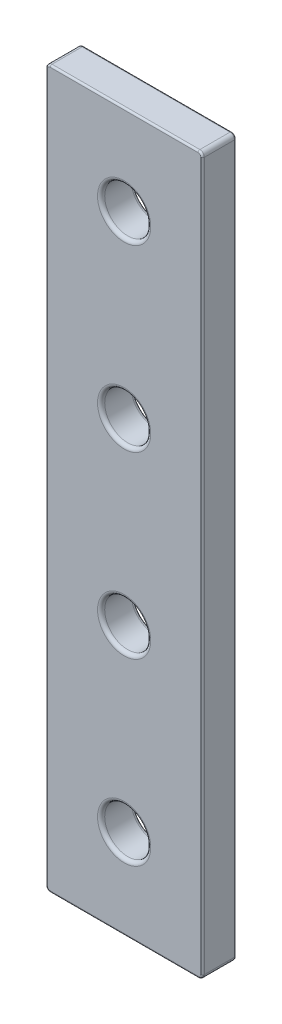
ISO-10303-21;
HEADER;
FILE_DESCRIPTION(('STEP AP214'),'2;1');
FILE_NAME('part.step','',(''),(''),'','','');
FILE_SCHEMA(('AUTOMOTIVE_DESIGN { 1 0 10303 214 1 1 1 1 }'));
ENDSEC;
DATA;
#1=APPLICATION_CONTEXT('core data for automotive mechanical design processes');
#2=APPLICATION_PROTOCOL_DEFINITION('international standard','automotive_design',2000,#1);
#3=PRODUCT_CONTEXT('',#1,'mechanical');
#4=PRODUCT('Part','Part','',(#3));
#5=PRODUCT_RELATED_PRODUCT_CATEGORY('part','',(#4));
#6=PRODUCT_DEFINITION_FORMATION('','',#4);
#7=PRODUCT_DEFINITION_CONTEXT('part definition',#1,'design');
#8=PRODUCT_DEFINITION('design','',#6,#7);
#9=PRODUCT_DEFINITION_SHAPE('','',#8);
#10=(LENGTH_UNIT() NAMED_UNIT(*) SI_UNIT(.MILLI.,.METRE.));
#11=(NAMED_UNIT(*) PLANE_ANGLE_UNIT() SI_UNIT($,.RADIAN.));
#12=(NAMED_UNIT(*) SI_UNIT($,.STERADIAN.) SOLID_ANGLE_UNIT());
#13=UNCERTAINTY_MEASURE_WITH_UNIT(LENGTH_MEASURE(1.E-05),#10,'distance_accuracy_value','');
#14=(GEOMETRIC_REPRESENTATION_CONTEXT(3) GLOBAL_UNCERTAINTY_ASSIGNED_CONTEXT((#13)) GLOBAL_UNIT_ASSIGNED_CONTEXT((#10,
#11,#12)) REPRESENTATION_CONTEXT('',''));
#15=CARTESIAN_POINT('',(0.,0.,0.));
#16=DIRECTION('',(0.,0.,1.));
#17=DIRECTION('',(1.,0.,0.));
#18=AXIS2_PLACEMENT_3D('',#15,#16,#17);
#19=CARTESIAN_POINT('',(0.,-38.1,-2.3876));
#20=DIRECTION('',(0.,0.,1.));
#21=DIRECTION('',(1.,0.,0.));
#22=AXIS2_PLACEMENT_3D('',#19,#20,#21);
#23=CYLINDRICAL_SURFACE('',#22,3.2639);
#24=CARTESIAN_POINT('',(0.,-38.1,-1.8796));
#25=DIRECTION('',(0.,0.,-1.));
#26=DIRECTION('',(-1.,0.,0.));
#27=AXIS2_PLACEMENT_3D('',#24,#25,#26);
#28=CIRCLE('',#27,3.2639);
#29=CARTESIAN_POINT('',(-3.2639,-38.1,-1.8796));
#30=VERTEX_POINT('',#29);
#31=EDGE_CURVE('E395',#30,#30,#28,.T.);
#32=ORIENTED_EDGE('',*,*,#31,.T.);
#33=EDGE_LOOP('',(#32));
#34=FACE_BOUND('',#33,.T.);
#35=CARTESIAN_POINT('',(0.,-38.1,1.8796));
#36=DIRECTION('',(0.,0.,-1.));
#37=DIRECTION('',(-1.,0.,0.));
#38=AXIS2_PLACEMENT_3D('',#35,#36,#37);
#39=CIRCLE('',#38,3.2639);
#40=CARTESIAN_POINT('',(-3.2639,-38.1,1.8796));
#41=VERTEX_POINT('',#40);
#42=EDGE_CURVE('E391',#41,#41,#39,.F.);
#43=ORIENTED_EDGE('',*,*,#42,.T.);
#44=EDGE_LOOP('',(#43));
#45=FACE_BOUND('',#44,.T.);
#46=ADVANCED_FACE('F51',(#34,#45),#23,.F.);
#47=CARTESIAN_POINT('',(0.,-12.7,-2.3876));
#48=DIRECTION('',(0.,0.,1.));
#49=DIRECTION('',(1.,0.,0.));
#50=AXIS2_PLACEMENT_3D('',#47,#48,#49);
#51=CYLINDRICAL_SURFACE('',#50,3.2639);
#52=CARTESIAN_POINT('',(0.,-12.7,-1.8796));
#53=DIRECTION('',(0.,0.,-1.));
#54=DIRECTION('',(-1.,0.,0.));
#55=AXIS2_PLACEMENT_3D('',#52,#53,#54);
#56=CIRCLE('',#55,3.2639);
#57=CARTESIAN_POINT('',(-3.2639,-12.7,-1.8796));
#58=VERTEX_POINT('',#57);
#59=EDGE_CURVE('E403',#58,#58,#56,.T.);
#60=ORIENTED_EDGE('',*,*,#59,.T.);
#61=EDGE_LOOP('',(#60));
#62=FACE_BOUND('',#61,.T.);
#63=CARTESIAN_POINT('',(0.,-12.7,1.8796));
#64=DIRECTION('',(0.,0.,-1.));
#65=DIRECTION('',(-1.,0.,0.));
#66=AXIS2_PLACEMENT_3D('',#63,#64,#65);
#67=CIRCLE('',#66,3.2639);
#68=CARTESIAN_POINT('',(-3.2639,-12.7,1.8796));
#69=VERTEX_POINT('',#68);
#70=EDGE_CURVE('E399',#69,#69,#67,.F.);
#71=ORIENTED_EDGE('',*,*,#70,.T.);
#72=EDGE_LOOP('',(#71));
#73=FACE_BOUND('',#72,.T.);
#74=ADVANCED_FACE('F446',(#62,#73),#51,.F.);
#75=CARTESIAN_POINT('',(-11.1125,50.8,2.3876));
#76=DIRECTION('',(0.,-1.,0.));
#77=DIRECTION('',(0.,0.,-1.));
#78=AXIS2_PLACEMENT_3D('',#75,#76,#77);
#79=PLANE('',#78);
#80=DIRECTION('',(0.,0.,-1.));
#81=VECTOR('',#80,1.);
#82=CARTESIAN_POINT('',(10.4775,50.8,2.3876));
#83=LINE('',#82,#81);
#84=CARTESIAN_POINT('',(10.4775,50.8,2.1336));
#85=VERTEX_POINT('',#84);
#86=CARTESIAN_POINT('',(10.4775,50.8,-2.1336));
#87=VERTEX_POINT('',#86);
#88=EDGE_CURVE('E232',#85,#87,#83,.T.);
#89=ORIENTED_EDGE('',*,*,#88,.T.);
#90=DIRECTION('',(-1.,0.,0.));
#91=VECTOR('',#90,1.);
#92=CARTESIAN_POINT('',(-10.4775,50.8,-2.1336));
#93=LINE('',#92,#91);
#94=CARTESIAN_POINT('',(-10.4775,50.8,-2.1336));
#95=VERTEX_POINT('',#94);
#96=EDGE_CURVE('E288',#87,#95,#93,.T.);
#97=ORIENTED_EDGE('',*,*,#96,.T.);
#98=DIRECTION('',(0.,0.,-1.));
#99=VECTOR('',#98,1.);
#100=CARTESIAN_POINT('',(-10.4775,50.8,2.3876));
#101=LINE('',#100,#99);
#102=CARTESIAN_POINT('',(-10.4775,50.8,2.1336));
#103=VERTEX_POINT('',#102);
#104=EDGE_CURVE('E225',#95,#103,#101,.F.);
#105=ORIENTED_EDGE('',*,*,#104,.T.);
#106=DIRECTION('',(-1.,0.,0.));
#107=VECTOR('',#106,1.);
#108=CARTESIAN_POINT('',(-11.1125,50.8,2.1336));
#109=LINE('',#108,#107);
#110=EDGE_CURVE('E285',#103,#85,#109,.F.);
#111=ORIENTED_EDGE('',*,*,#110,.T.);
#112=EDGE_LOOP('',(#89,#97,#105,#111));
#113=FACE_BOUND('',#112,.T.);
#114=ADVANCED_FACE('F448',(#113),#79,.F.);
#115=CARTESIAN_POINT('',(-11.1125,50.8,2.3876));
#116=DIRECTION('',(1.,0.,0.));
#117=DIRECTION('',(0.,0.,-1.));
#118=AXIS2_PLACEMENT_3D('',#115,#116,#117);
#119=PLANE('',#118);
#120=DIRECTION('',(0.,0.,-1.));
#121=VECTOR('',#120,1.);
#122=CARTESIAN_POINT('',(-11.1125,50.165,2.3876));
#123=LINE('',#122,#121);
#124=CARTESIAN_POINT('',(-11.1125,50.165,2.1336));
#125=VERTEX_POINT('',#124);
#126=CARTESIAN_POINT('',(-11.1125,50.165,-2.1336));
#127=VERTEX_POINT('',#126);
#128=EDGE_CURVE('E614',#125,#127,#123,.T.);
#129=ORIENTED_EDGE('',*,*,#128,.T.);
#130=DIRECTION('',(0.,-1.,0.));
#131=VECTOR('',#130,1.);
#132=CARTESIAN_POINT('',(-11.1125,-50.165,-2.1336));
#133=LINE('',#132,#131);
#134=CARTESIAN_POINT('',(-11.1125,-50.165,-2.1336));
#135=VERTEX_POINT('',#134);
#136=EDGE_CURVE('E276',#127,#135,#133,.T.);
#137=ORIENTED_EDGE('',*,*,#136,.T.);
#138=DIRECTION('',(0.,0.,-1.));
#139=VECTOR('',#138,1.);
#140=CARTESIAN_POINT('',(-11.1125,-50.165,2.3876));
#141=LINE('',#140,#139);
#142=CARTESIAN_POINT('',(-11.1125,-50.165,2.1336));
#143=VERTEX_POINT('',#142);
#144=EDGE_CURVE('E610',#135,#143,#141,.F.);
#145=ORIENTED_EDGE('',*,*,#144,.T.);
#146=DIRECTION('',(0.,-1.,0.));
#147=VECTOR('',#146,1.);
#148=CARTESIAN_POINT('',(-11.1125,50.8,2.1336));
#149=LINE('',#148,#147);
#150=EDGE_CURVE('E273',#143,#125,#149,.F.);
#151=ORIENTED_EDGE('',*,*,#150,.T.);
#152=EDGE_LOOP('',(#129,#137,#145,#151));
#153=FACE_BOUND('',#152,.T.);
#154=ADVANCED_FACE('F454',(#153),#119,.F.);
#155=CARTESIAN_POINT('',(-11.1125,-50.8,2.3876));
#156=DIRECTION('',(0.,1.,0.));
#157=DIRECTION('',(0.,0.,1.));
#158=AXIS2_PLACEMENT_3D('',#155,#156,#157);
#159=PLANE('',#158);
#160=DIRECTION('',(0.,0.,-1.));
#161=VECTOR('',#160,1.);
#162=CARTESIAN_POINT('',(-10.4775,-50.8,2.3876));
#163=LINE('',#162,#161);
#164=CARTESIAN_POINT('',(-10.4775,-50.8,2.1336));
#165=VERTEX_POINT('',#164);
#166=CARTESIAN_POINT('',(-10.4775,-50.8,-2.1336));
#167=VERTEX_POINT('',#166);
#168=EDGE_CURVE('E623',#165,#167,#163,.T.);
#169=ORIENTED_EDGE('',*,*,#168,.T.);
#170=DIRECTION('',(1.,0.,0.));
#171=VECTOR('',#170,1.);
#172=CARTESIAN_POINT('',(10.4775,-50.8,-2.1336));
#173=LINE('',#172,#171);
#174=CARTESIAN_POINT('',(10.4775,-50.8,-2.1336));
#175=VERTEX_POINT('',#174);
#176=EDGE_CURVE('E264',#167,#175,#173,.T.);
#177=ORIENTED_EDGE('',*,*,#176,.T.);
#178=DIRECTION('',(0.,0.,-1.));
#179=VECTOR('',#178,1.);
#180=CARTESIAN_POINT('',(10.4775,-50.8,2.3876));
#181=LINE('',#180,#179);
#182=CARTESIAN_POINT('',(10.4775,-50.8,2.1336));
#183=VERTEX_POINT('',#182);
#184=EDGE_CURVE('E619',#175,#183,#181,.F.);
#185=ORIENTED_EDGE('',*,*,#184,.T.);
#186=DIRECTION('',(1.,0.,0.));
#187=VECTOR('',#186,1.);
#188=CARTESIAN_POINT('',(-11.1125,-50.8,2.1336));
#189=LINE('',#188,#187);
#190=EDGE_CURVE('E261',#183,#165,#189,.F.);
#191=ORIENTED_EDGE('',*,*,#190,.T.);
#192=EDGE_LOOP('',(#169,#177,#185,#191));
#193=FACE_BOUND('',#192,.T.);
#194=ADVANCED_FACE('F576',(#193),#159,.F.);
#195=CARTESIAN_POINT('',(11.1125,50.8,2.3876));
#196=DIRECTION('',(-1.,0.,0.));
#197=DIRECTION('',(0.,0.,1.));
#198=AXIS2_PLACEMENT_3D('',#195,#196,#197);
#199=PLANE('',#198);
#200=DIRECTION('',(0.,0.,-1.));
#201=VECTOR('',#200,1.);
#202=CARTESIAN_POINT('',(11.1125,-50.165,2.3876));
#203=LINE('',#202,#201);
#204=CARTESIAN_POINT('',(11.1125,-50.165,2.1336));
#205=VERTEX_POINT('',#204);
#206=CARTESIAN_POINT('',(11.1125,-50.165,-2.1336));
#207=VERTEX_POINT('',#206);
#208=EDGE_CURVE('E627',#205,#207,#203,.T.);
#209=ORIENTED_EDGE('',*,*,#208,.T.);
#210=DIRECTION('',(0.,1.,0.));
#211=VECTOR('',#210,1.);
#212=CARTESIAN_POINT('',(11.1125,50.165,-2.1336));
#213=LINE('',#212,#211);
#214=CARTESIAN_POINT('',(11.1125,50.165,-2.1336));
#215=VERTEX_POINT('',#214);
#216=EDGE_CURVE('E321',#207,#215,#213,.T.);
#217=ORIENTED_EDGE('',*,*,#216,.T.);
#218=DIRECTION('',(0.,0.,-1.));
#219=VECTOR('',#218,1.);
#220=CARTESIAN_POINT('',(11.1125,50.165,2.3876));
#221=LINE('',#220,#219);
#222=CARTESIAN_POINT('',(11.1125,50.165,2.1336));
#223=VERTEX_POINT('',#222);
#224=EDGE_CURVE('E347',#215,#223,#221,.F.);
#225=ORIENTED_EDGE('',*,*,#224,.T.);
#226=DIRECTION('',(0.,1.,0.));
#227=VECTOR('',#226,1.);
#228=CARTESIAN_POINT('',(11.1125,50.8,2.1336));
#229=LINE('',#228,#227);
#230=EDGE_CURVE('E318',#223,#205,#229,.F.);
#231=ORIENTED_EDGE('',*,*,#230,.T.);
#232=EDGE_LOOP('',(#209,#217,#225,#231));
#233=FACE_BOUND('',#232,.T.);
#234=ADVANCED_FACE('F568',(#233),#199,.F.);
#235=CARTESIAN_POINT('',(0.,0.,2.3876));
#236=DIRECTION('',(0.,0.,-1.));
#237=DIRECTION('',(-1.,0.,0.));
#238=AXIS2_PLACEMENT_3D('',#235,#236,#237);
#239=PLANE('',#238);
#240=CARTESIAN_POINT('',(0.,-38.1,2.3876));
#241=DIRECTION('',(0.,0.,-1.));
#242=DIRECTION('',(-1.,0.,0.));
#243=AXIS2_PLACEMENT_3D('',#240,#241,#242);
#244=CIRCLE('',#243,3.7719);
#245=CARTESIAN_POINT('',(-3.7719,-38.1,2.3876));
#246=VERTEX_POINT('',#245);
#247=EDGE_CURVE('E11',#246,#246,#244,.T.);
#248=ORIENTED_EDGE('',*,*,#247,.T.);
#249=EDGE_LOOP('',(#248));
#250=FACE_BOUND('',#249,.T.);
#251=CARTESIAN_POINT('',(0.,-12.7,2.3876));
#252=DIRECTION('',(0.,0.,-1.));
#253=DIRECTION('',(-1.,0.,0.));
#254=AXIS2_PLACEMENT_3D('',#251,#252,#253);
#255=CIRCLE('',#254,3.7719);
#256=CARTESIAN_POINT('',(-3.7719,-12.7,2.3876));
#257=VERTEX_POINT('',#256);
#258=EDGE_CURVE('E60',#257,#257,#255,.T.);
#259=ORIENTED_EDGE('',*,*,#258,.T.);
#260=EDGE_LOOP('',(#259));
#261=FACE_BOUND('',#260,.T.);
#262=CARTESIAN_POINT('',(0.,38.1,2.3876));
#263=DIRECTION('',(0.,0.,-1.));
#264=DIRECTION('',(-1.,0.,0.));
#265=AXIS2_PLACEMENT_3D('',#262,#263,#264);
#266=CIRCLE('',#265,3.7719);
#267=CARTESIAN_POINT('',(-3.7719,38.1,2.3876));
#268=VERTEX_POINT('',#267);
#269=EDGE_CURVE('E427',#268,#268,#266,.T.);
#270=ORIENTED_EDGE('',*,*,#269,.T.);
#271=EDGE_LOOP('',(#270));
#272=FACE_BOUND('',#271,.T.);
#273=CARTESIAN_POINT('',(0.,12.7,2.3876));
#274=DIRECTION('',(0.,0.,-1.));
#275=DIRECTION('',(-1.,0.,0.));
#276=AXIS2_PLACEMENT_3D('',#273,#274,#275);
#277=CIRCLE('',#276,3.7719);
#278=CARTESIAN_POINT('',(-3.7719,12.7,2.3876));
#279=VERTEX_POINT('',#278);
#280=EDGE_CURVE('E423',#279,#279,#277,.T.);
#281=ORIENTED_EDGE('',*,*,#280,.T.);
#282=EDGE_LOOP('',(#281));
#283=FACE_BOUND('',#282,.T.);
#284=DIRECTION('',(1.,0.,0.));
#285=VECTOR('',#284,1.);
#286=CARTESIAN_POINT('',(0.,-50.546,2.3876));
#287=LINE('',#286,#285);
#288=CARTESIAN_POINT('',(-10.4775,-50.546,2.3876));
#289=VERTEX_POINT('',#288);
#290=CARTESIAN_POINT('',(10.4775,-50.546,2.3876));
#291=VERTEX_POINT('',#290);
#292=EDGE_CURVE('E70',#289,#291,#287,.T.);
#293=ORIENTED_EDGE('',*,*,#292,.T.);
#294=CARTESIAN_POINT('',(10.4775,-50.165,2.3876));
#295=DIRECTION('',(0.,0.,-1.));
#296=DIRECTION('',(-1.,0.,0.));
#297=AXIS2_PLACEMENT_3D('',#294,#295,#296);
#298=CIRCLE('',#297,0.381);
#299=CARTESIAN_POINT('',(10.8585,-50.165,2.3876));
#300=VERTEX_POINT('',#299);
#301=EDGE_CURVE('E315',#291,#300,#298,.F.);
#302=ORIENTED_EDGE('',*,*,#301,.T.);
#303=DIRECTION('',(0.,1.,0.));
#304=VECTOR('',#303,1.);
#305=CARTESIAN_POINT('',(10.8585,0.,2.3876));
#306=LINE('',#305,#304);
#307=CARTESIAN_POINT('',(10.8585,50.165,2.3876));
#308=VERTEX_POINT('',#307);
#309=EDGE_CURVE('E296',#300,#308,#306,.T.);
#310=ORIENTED_EDGE('',*,*,#309,.T.);
#311=CARTESIAN_POINT('',(10.4775,50.165,2.3876));
#312=DIRECTION('',(0.,0.,-1.));
#313=DIRECTION('',(-1.,0.,0.));
#314=AXIS2_PLACEMENT_3D('',#311,#312,#313);
#315=CIRCLE('',#314,0.381);
#316=CARTESIAN_POINT('',(10.4775,50.546,2.3876));
#317=VERTEX_POINT('',#316);
#318=EDGE_CURVE('E299',#308,#317,#315,.F.);
#319=ORIENTED_EDGE('',*,*,#318,.T.);
#320=DIRECTION('',(-1.,0.,0.));
#321=VECTOR('',#320,1.);
#322=CARTESIAN_POINT('',(0.,50.546,2.3876));
#323=LINE('',#322,#321);
#324=CARTESIAN_POINT('',(-10.4775,50.546,2.3876));
#325=VERTEX_POINT('',#324);
#326=EDGE_CURVE('E302',#317,#325,#323,.T.);
#327=ORIENTED_EDGE('',*,*,#326,.T.);
#328=CARTESIAN_POINT('',(-10.4775,50.165,2.3876));
#329=DIRECTION('',(0.,0.,-1.));
#330=DIRECTION('',(-1.,0.,0.));
#331=AXIS2_PLACEMENT_3D('',#328,#329,#330);
#332=CIRCLE('',#331,0.381);
#333=CARTESIAN_POINT('',(-10.8585,50.165,2.3876));
#334=VERTEX_POINT('',#333);
#335=EDGE_CURVE('E305',#325,#334,#332,.F.);
#336=ORIENTED_EDGE('',*,*,#335,.T.);
#337=DIRECTION('',(0.,-1.,0.));
#338=VECTOR('',#337,1.);
#339=CARTESIAN_POINT('',(-10.8585,0.,2.3876));
#340=LINE('',#339,#338);
#341=CARTESIAN_POINT('',(-10.8585,-50.165,2.3876));
#342=VERTEX_POINT('',#341);
#343=EDGE_CURVE('E308',#334,#342,#340,.T.);
#344=ORIENTED_EDGE('',*,*,#343,.T.);
#345=CARTESIAN_POINT('',(-10.4775,-50.165,2.3876));
#346=DIRECTION('',(0.,0.,-1.));
#347=DIRECTION('',(-1.,0.,0.));
#348=AXIS2_PLACEMENT_3D('',#345,#346,#347);
#349=CIRCLE('',#348,0.381);
#350=EDGE_CURVE('E78',#342,#289,#349,.F.);
#351=ORIENTED_EDGE('',*,*,#350,.T.);
#352=EDGE_LOOP('',(#293,#302,#310,#319,#327,#336,#344,#351));
#353=FACE_BOUND('',#352,.T.);
#354=ADVANCED_FACE('F435',(#250,#261,#272,#283,#353),#239,.F.);
#355=CARTESIAN_POINT('',(0.,0.,-2.3876));
#356=DIRECTION('',(0.,0.,-1.));
#357=DIRECTION('',(-1.,0.,0.));
#358=AXIS2_PLACEMENT_3D('',#355,#356,#357);
#359=PLANE('',#358);
#360=CARTESIAN_POINT('',(0.,-38.1,-2.3876));
#361=DIRECTION('',(0.,0.,-1.));
#362=DIRECTION('',(-1.,0.,0.));
#363=AXIS2_PLACEMENT_3D('',#360,#361,#362);
#364=CIRCLE('',#363,3.7719);
#365=CARTESIAN_POINT('',(-3.7719,-38.1,-2.3876));
#366=VERTEX_POINT('',#365);
#367=EDGE_CURVE('E388',#366,#366,#364,.F.);
#368=ORIENTED_EDGE('',*,*,#367,.T.);
#369=EDGE_LOOP('',(#368));
#370=FACE_BOUND('',#369,.T.);
#371=CARTESIAN_POINT('',(0.,-12.7,-2.3876));
#372=DIRECTION('',(0.,0.,-1.));
#373=DIRECTION('',(-1.,0.,0.));
#374=AXIS2_PLACEMENT_3D('',#371,#372,#373);
#375=CIRCLE('',#374,3.7719);
#376=CARTESIAN_POINT('',(-3.7719,-12.7,-2.3876));
#377=VERTEX_POINT('',#376);
#378=EDGE_CURVE('E384',#377,#377,#375,.F.);
#379=ORIENTED_EDGE('',*,*,#378,.T.);
#380=EDGE_LOOP('',(#379));
#381=FACE_BOUND('',#380,.T.);
#382=CARTESIAN_POINT('',(0.,38.1,-2.3876));
#383=DIRECTION('',(0.,0.,-1.));
#384=DIRECTION('',(-1.,0.,0.));
#385=AXIS2_PLACEMENT_3D('',#382,#383,#384);
#386=CIRCLE('',#385,3.7719);
#387=CARTESIAN_POINT('',(-3.7719,38.1,-2.3876));
#388=VERTEX_POINT('',#387);
#389=EDGE_CURVE('E380',#388,#388,#386,.F.);
#390=ORIENTED_EDGE('',*,*,#389,.T.);
#391=EDGE_LOOP('',(#390));
#392=FACE_BOUND('',#391,.T.);
#393=CARTESIAN_POINT('',(0.,12.7,-2.3876));
#394=DIRECTION('',(0.,0.,-1.));
#395=DIRECTION('',(-1.,0.,0.));
#396=AXIS2_PLACEMENT_3D('',#393,#394,#395);
#397=CIRCLE('',#396,3.7719);
#398=CARTESIAN_POINT('',(-3.7719,12.7,-2.3876));
#399=VERTEX_POINT('',#398);
#400=EDGE_CURVE('E323',#399,#399,#397,.F.);
#401=ORIENTED_EDGE('',*,*,#400,.T.);
#402=EDGE_LOOP('',(#401));
#403=FACE_BOUND('',#402,.T.);
#404=DIRECTION('',(0.,1.,0.));
#405=VECTOR('',#404,1.);
#406=CARTESIAN_POINT('',(10.8585,-50.165,-2.3876));
#407=LINE('',#406,#405);
#408=CARTESIAN_POINT('',(10.8585,50.165,-2.3876));
#409=VERTEX_POINT('',#408);
#410=CARTESIAN_POINT('',(10.8585,-50.165,-2.3876));
#411=VERTEX_POINT('',#410);
#412=EDGE_CURVE('E201',#409,#411,#407,.F.);
#413=ORIENTED_EDGE('',*,*,#412,.T.);
#414=CARTESIAN_POINT('',(10.4775,-50.165,-2.3876));
#415=DIRECTION('',(0.,0.,-1.));
#416=DIRECTION('',(-1.,0.,0.));
#417=AXIS2_PLACEMENT_3D('',#414,#415,#416);
#418=CIRCLE('',#417,0.381);
#419=CARTESIAN_POINT('',(10.4775,-50.546,-2.3876));
#420=VERTEX_POINT('',#419);
#421=EDGE_CURVE('E250',#411,#420,#418,.T.);
#422=ORIENTED_EDGE('',*,*,#421,.T.);
#423=DIRECTION('',(1.,0.,0.));
#424=VECTOR('',#423,1.);
#425=CARTESIAN_POINT('',(-10.4775,-50.546,-2.3876));
#426=LINE('',#425,#424);
#427=CARTESIAN_POINT('',(-10.4775,-50.546,-2.3876));
#428=VERTEX_POINT('',#427);
#429=EDGE_CURVE('E247',#420,#428,#426,.F.);
#430=ORIENTED_EDGE('',*,*,#429,.T.);
#431=CARTESIAN_POINT('',(-10.4775,-50.165,-2.3876));
#432=DIRECTION('',(0.,0.,-1.));
#433=DIRECTION('',(-1.,0.,0.));
#434=AXIS2_PLACEMENT_3D('',#431,#432,#433);
#435=CIRCLE('',#434,0.381);
#436=CARTESIAN_POINT('',(-10.8585,-50.165,-2.3876));
#437=VERTEX_POINT('',#436);
#438=EDGE_CURVE('E244',#428,#437,#435,.T.);
#439=ORIENTED_EDGE('',*,*,#438,.T.);
#440=DIRECTION('',(0.,-1.,0.));
#441=VECTOR('',#440,1.);
#442=CARTESIAN_POINT('',(-10.8585,50.165,-2.3876));
#443=LINE('',#442,#441);
#444=CARTESIAN_POINT('',(-10.8585,50.165,-2.3876));
#445=VERTEX_POINT('',#444);
#446=EDGE_CURVE('E241',#437,#445,#443,.F.);
#447=ORIENTED_EDGE('',*,*,#446,.T.);
#448=CARTESIAN_POINT('',(-10.4775,50.165,-2.3876));
#449=DIRECTION('',(0.,0.,-1.));
#450=DIRECTION('',(-1.,0.,0.));
#451=AXIS2_PLACEMENT_3D('',#448,#449,#450);
#452=CIRCLE('',#451,0.381);
#453=CARTESIAN_POINT('',(-10.4775,50.546,-2.3876));
#454=VERTEX_POINT('',#453);
#455=EDGE_CURVE('E238',#445,#454,#452,.T.);
#456=ORIENTED_EDGE('',*,*,#455,.T.);
#457=DIRECTION('',(-1.,0.,0.));
#458=VECTOR('',#457,1.);
#459=CARTESIAN_POINT('',(10.4775,50.546,-2.3876));
#460=LINE('',#459,#458);
#461=CARTESIAN_POINT('',(10.4775,50.546,-2.3876));
#462=VERTEX_POINT('',#461);
#463=EDGE_CURVE('E204',#454,#462,#460,.F.);
#464=ORIENTED_EDGE('',*,*,#463,.T.);
#465=CARTESIAN_POINT('',(10.4775,50.165,-2.3876));
#466=DIRECTION('',(0.,0.,-1.));
#467=DIRECTION('',(-1.,0.,0.));
#468=AXIS2_PLACEMENT_3D('',#465,#466,#467);
#469=CIRCLE('',#468,0.381);
#470=EDGE_CURVE('E196',#462,#409,#469,.T.);
#471=ORIENTED_EDGE('',*,*,#470,.T.);
#472=EDGE_LOOP('',(#413,#422,#430,#439,#447,#456,#464,#471));
#473=FACE_BOUND('',#472,.T.);
#474=ADVANCED_FACE('F198',(#370,#381,#392,#403,#473),#359,.T.);
#475=CARTESIAN_POINT('',(10.4775,-50.165,2.3876));
#476=DIRECTION('',(0.,0.,-1.));
#477=DIRECTION('',(-1.,0.,0.));
#478=AXIS2_PLACEMENT_3D('',#475,#476,#477);
#479=CYLINDRICAL_SURFACE('',#478,0.635);
#480=ORIENTED_EDGE('',*,*,#184,.F.);
#481=CARTESIAN_POINT('',(10.4775,-50.165,-2.1336));
#482=DIRECTION('',(0.,0.,-1.));
#483=DIRECTION('',(-1.,0.,0.));
#484=AXIS2_PLACEMENT_3D('',#481,#482,#483);
#485=CIRCLE('',#484,0.635);
#486=EDGE_CURVE('E257',#175,#207,#485,.F.);
#487=ORIENTED_EDGE('',*,*,#486,.T.);
#488=ORIENTED_EDGE('',*,*,#208,.F.);
#489=CARTESIAN_POINT('',(10.4775,-50.165,2.1336));
#490=DIRECTION('',(0.,0.,-1.));
#491=DIRECTION('',(-1.,0.,0.));
#492=AXIS2_PLACEMENT_3D('',#489,#490,#491);
#493=CIRCLE('',#492,0.635);
#494=EDGE_CURVE('E253',#205,#183,#493,.T.);
#495=ORIENTED_EDGE('',*,*,#494,.T.);
#496=EDGE_LOOP('',(#480,#487,#488,#495));
#497=FACE_BOUND('',#496,.T.);
#498=ADVANCED_FACE('F572',(#497),#479,.T.);
#499=CARTESIAN_POINT('',(-10.4775,-50.165,2.3876));
#500=DIRECTION('',(0.,0.,-1.));
#501=DIRECTION('',(-1.,0.,0.));
#502=AXIS2_PLACEMENT_3D('',#499,#500,#501);
#503=CYLINDRICAL_SURFACE('',#502,0.635);
#504=ORIENTED_EDGE('',*,*,#144,.F.);
#505=CARTESIAN_POINT('',(-10.4775,-50.165,-2.1336));
#506=DIRECTION('',(0.,0.,-1.));
#507=DIRECTION('',(-1.,0.,0.));
#508=AXIS2_PLACEMENT_3D('',#505,#506,#507);
#509=CIRCLE('',#508,0.635);
#510=EDGE_CURVE('E270',#135,#167,#509,.F.);
#511=ORIENTED_EDGE('',*,*,#510,.T.);
#512=ORIENTED_EDGE('',*,*,#168,.F.);
#513=CARTESIAN_POINT('',(-10.4775,-50.165,2.1336));
#514=DIRECTION('',(0.,0.,-1.));
#515=DIRECTION('',(-1.,0.,0.));
#516=AXIS2_PLACEMENT_3D('',#513,#514,#515);
#517=CIRCLE('',#516,0.635);
#518=EDGE_CURVE('E267',#165,#143,#517,.T.);
#519=ORIENTED_EDGE('',*,*,#518,.T.);
#520=EDGE_LOOP('',(#504,#511,#512,#519));
#521=FACE_BOUND('',#520,.T.);
#522=ADVANCED_FACE('F586',(#521),#503,.T.);
#523=CARTESIAN_POINT('',(-10.4775,50.165,2.3876));
#524=DIRECTION('',(0.,0.,-1.));
#525=DIRECTION('',(-1.,0.,0.));
#526=AXIS2_PLACEMENT_3D('',#523,#524,#525);
#527=CYLINDRICAL_SURFACE('',#526,0.635);
#528=ORIENTED_EDGE('',*,*,#104,.F.);
#529=CARTESIAN_POINT('',(-10.4775,50.165,-2.1336));
#530=DIRECTION('',(0.,0.,-1.));
#531=DIRECTION('',(-1.,0.,0.));
#532=AXIS2_PLACEMENT_3D('',#529,#530,#531);
#533=CIRCLE('',#532,0.635);
#534=EDGE_CURVE('E282',#95,#127,#533,.F.);
#535=ORIENTED_EDGE('',*,*,#534,.T.);
#536=ORIENTED_EDGE('',*,*,#128,.F.);
#537=CARTESIAN_POINT('',(-10.4775,50.165,2.1336));
#538=DIRECTION('',(0.,0.,-1.));
#539=DIRECTION('',(-1.,0.,0.));
#540=AXIS2_PLACEMENT_3D('',#537,#538,#539);
#541=CIRCLE('',#540,0.635);
#542=EDGE_CURVE('E279',#125,#103,#541,.T.);
#543=ORIENTED_EDGE('',*,*,#542,.T.);
#544=EDGE_LOOP('',(#528,#535,#536,#543));
#545=FACE_BOUND('',#544,.T.);
#546=ADVANCED_FACE('F563',(#545),#527,.T.);
#547=CARTESIAN_POINT('',(10.4775,50.165,2.3876));
#548=DIRECTION('',(0.,0.,-1.));
#549=DIRECTION('',(-1.,0.,0.));
#550=AXIS2_PLACEMENT_3D('',#547,#548,#549);
#551=CYLINDRICAL_SURFACE('',#550,0.635);
#552=ORIENTED_EDGE('',*,*,#224,.F.);
#553=CARTESIAN_POINT('',(10.4775,50.165,-2.1336));
#554=DIRECTION('',(0.,0.,-1.));
#555=DIRECTION('',(-1.,0.,0.));
#556=AXIS2_PLACEMENT_3D('',#553,#554,#555);
#557=CIRCLE('',#556,0.635);
#558=EDGE_CURVE('E214',#215,#87,#557,.F.);
#559=ORIENTED_EDGE('',*,*,#558,.T.);
#560=ORIENTED_EDGE('',*,*,#88,.F.);
#561=CARTESIAN_POINT('',(10.4775,50.165,2.1336));
#562=DIRECTION('',(0.,0.,-1.));
#563=DIRECTION('',(-1.,0.,0.));
#564=AXIS2_PLACEMENT_3D('',#561,#562,#563);
#565=CIRCLE('',#564,0.635);
#566=EDGE_CURVE('E291',#85,#223,#565,.T.);
#567=ORIENTED_EDGE('',*,*,#566,.T.);
#568=EDGE_LOOP('',(#552,#559,#560,#567));
#569=FACE_BOUND('',#568,.T.);
#570=ADVANCED_FACE('F461',(#569),#551,.T.);
#571=CARTESIAN_POINT('',(0.,38.1,-2.3876));
#572=DIRECTION('',(0.,0.,1.));
#573=DIRECTION('',(1.,0.,0.));
#574=AXIS2_PLACEMENT_3D('',#571,#572,#573);
#575=CYLINDRICAL_SURFACE('',#574,3.2639);
#576=CARTESIAN_POINT('',(0.,38.1,-1.8796));
#577=DIRECTION('',(0.,0.,-1.));
#578=DIRECTION('',(-1.,0.,0.));
#579=AXIS2_PLACEMENT_3D('',#576,#577,#578);
#580=CIRCLE('',#579,3.2639);
#581=CARTESIAN_POINT('',(-3.2639,38.1,-1.8796));
#582=VERTEX_POINT('',#581);
#583=EDGE_CURVE('E411',#582,#582,#580,.T.);
#584=ORIENTED_EDGE('',*,*,#583,.T.);
#585=EDGE_LOOP('',(#584));
#586=FACE_BOUND('',#585,.T.);
#587=CARTESIAN_POINT('',(0.,38.1,1.8796));
#588=DIRECTION('',(0.,0.,-1.));
#589=DIRECTION('',(-1.,0.,0.));
#590=AXIS2_PLACEMENT_3D('',#587,#588,#589);
#591=CIRCLE('',#590,3.2639);
#592=CARTESIAN_POINT('',(-3.2639,38.1,1.8796));
#593=VERTEX_POINT('',#592);
#594=EDGE_CURVE('E407',#593,#593,#591,.F.);
#595=ORIENTED_EDGE('',*,*,#594,.T.);
#596=EDGE_LOOP('',(#595));
#597=FACE_BOUND('',#596,.T.);
#598=ADVANCED_FACE('F552',(#586,#597),#575,.F.);
#599=CARTESIAN_POINT('',(0.,12.7,-2.3876));
#600=DIRECTION('',(0.,0.,1.));
#601=DIRECTION('',(1.,0.,0.));
#602=AXIS2_PLACEMENT_3D('',#599,#600,#601);
#603=CYLINDRICAL_SURFACE('',#602,3.2639);
#604=CARTESIAN_POINT('',(0.,12.7,-1.8796));
#605=DIRECTION('',(0.,0.,-1.));
#606=DIRECTION('',(-1.,0.,0.));
#607=AXIS2_PLACEMENT_3D('',#604,#605,#606);
#608=CIRCLE('',#607,3.2639);
#609=CARTESIAN_POINT('',(-3.2639,12.7,-1.8796));
#610=VERTEX_POINT('',#609);
#611=EDGE_CURVE('E419',#610,#610,#608,.T.);
#612=ORIENTED_EDGE('',*,*,#611,.T.);
#613=EDGE_LOOP('',(#612));
#614=FACE_BOUND('',#613,.T.);
#615=CARTESIAN_POINT('',(0.,12.7,1.8796));
#616=DIRECTION('',(0.,0.,-1.));
#617=DIRECTION('',(-1.,0.,0.));
#618=AXIS2_PLACEMENT_3D('',#615,#616,#617);
#619=CIRCLE('',#618,3.2639);
#620=CARTESIAN_POINT('',(-3.2639,12.7,1.8796));
#621=VERTEX_POINT('',#620);
#622=EDGE_CURVE('E415',#621,#621,#619,.F.);
#623=ORIENTED_EDGE('',*,*,#622,.T.);
#624=EDGE_LOOP('',(#623));
#625=FACE_BOUND('',#624,.T.);
#626=ADVANCED_FACE('F492',(#614,#625),#603,.F.);
#627=CARTESIAN_POINT('',(-10.4775,50.165,-2.1336));
#628=DIRECTION('',(0.,0.,-1.));
#629=DIRECTION('',(-1.,0.,0.));
#630=AXIS2_PLACEMENT_3D('',#627,#628,#629);
#631=TOROIDAL_SURFACE('',#630,0.381,0.254);
#632=CARTESIAN_POINT('',(-10.8585,50.165,-2.1336));
#633=DIRECTION('',(0.,-1.,0.));
#634=DIRECTION('',(0.,0.,-1.));
#635=AXIS2_PLACEMENT_3D('',#632,#633,#634);
#636=CIRCLE('',#635,0.254);
#637=EDGE_CURVE('E339',#127,#445,#636,.T.);
#638=ORIENTED_EDGE('',*,*,#637,.F.);
#639=ORIENTED_EDGE('',*,*,#534,.F.);
#640=CARTESIAN_POINT('',(-10.4775,50.546,-2.1336));
#641=DIRECTION('',(1.,0.,0.));
#642=DIRECTION('',(0.,0.,-1.));
#643=AXIS2_PLACEMENT_3D('',#640,#641,#642);
#644=CIRCLE('',#643,0.254);
#645=EDGE_CURVE('E343',#454,#95,#644,.T.);
#646=ORIENTED_EDGE('',*,*,#645,.F.);
#647=ORIENTED_EDGE('',*,*,#455,.F.);
#648=EDGE_LOOP('',(#638,#639,#646,#647));
#649=FACE_BOUND('',#648,.T.);
#650=ADVANCED_FACE('F488',(#649),#631,.T.);
#651=CARTESIAN_POINT('',(-11.1125,50.546,-2.1336));
#652=DIRECTION('',(1.,0.,0.));
#653=DIRECTION('',(0.,0.,-1.));
#654=AXIS2_PLACEMENT_3D('',#651,#652,#653);
#655=CYLINDRICAL_SURFACE('',#654,0.254);
#656=ORIENTED_EDGE('',*,*,#645,.T.);
#657=ORIENTED_EDGE('',*,*,#96,.F.);
#658=CARTESIAN_POINT('',(10.4775,50.546,-2.1336));
#659=DIRECTION('',(1.,0.,0.));
#660=DIRECTION('',(0.,0.,-1.));
#661=AXIS2_PLACEMENT_3D('',#658,#659,#660);
#662=CIRCLE('',#661,0.254);
#663=EDGE_CURVE('E336',#462,#87,#662,.T.);
#664=ORIENTED_EDGE('',*,*,#663,.F.);
#665=ORIENTED_EDGE('',*,*,#463,.F.);
#666=EDGE_LOOP('',(#656,#657,#664,#665));
#667=FACE_BOUND('',#666,.T.);
#668=ADVANCED_FACE('F484',(#667),#655,.T.);
#669=CARTESIAN_POINT('',(-10.8585,50.8,-2.1336));
#670=DIRECTION('',(0.,1.,0.));
#671=DIRECTION('',(0.,0.,1.));
#672=AXIS2_PLACEMENT_3D('',#669,#670,#671);
#673=CYLINDRICAL_SURFACE('',#672,0.254);
#674=ORIENTED_EDGE('',*,*,#637,.T.);
#675=ORIENTED_EDGE('',*,*,#446,.F.);
#676=CARTESIAN_POINT('',(-10.8585,-50.165,-2.1336));
#677=DIRECTION('',(0.,-1.,0.));
#678=DIRECTION('',(0.,0.,-1.));
#679=AXIS2_PLACEMENT_3D('',#676,#677,#678);
#680=CIRCLE('',#679,0.254);
#681=EDGE_CURVE('E218',#135,#437,#680,.T.);
#682=ORIENTED_EDGE('',*,*,#681,.F.);
#683=ORIENTED_EDGE('',*,*,#136,.F.);
#684=EDGE_LOOP('',(#674,#675,#682,#683));
#685=FACE_BOUND('',#684,.T.);
#686=ADVANCED_FACE('F481',(#685),#673,.T.);
#687=CARTESIAN_POINT('',(10.4775,50.165,-2.1336));
#688=DIRECTION('',(0.,0.,-1.));
#689=DIRECTION('',(-1.,0.,0.));
#690=AXIS2_PLACEMENT_3D('',#687,#688,#689);
#691=TOROIDAL_SURFACE('',#690,0.381,0.254);
#692=ORIENTED_EDGE('',*,*,#663,.T.);
#693=ORIENTED_EDGE('',*,*,#558,.F.);
#694=CARTESIAN_POINT('',(10.8585,50.165,-2.1336));
#695=DIRECTION('',(0.,-1.,0.));
#696=DIRECTION('',(0.,0.,-1.));
#697=AXIS2_PLACEMENT_3D('',#694,#695,#696);
#698=CIRCLE('',#697,0.254);
#699=EDGE_CURVE('E212',#409,#215,#698,.T.);
#700=ORIENTED_EDGE('',*,*,#699,.F.);
#701=ORIENTED_EDGE('',*,*,#470,.F.);
#702=EDGE_LOOP('',(#692,#693,#700,#701));
#703=FACE_BOUND('',#702,.T.);
#704=ADVANCED_FACE('F213',(#703),#691,.T.);
#705=CARTESIAN_POINT('',(-10.4775,-50.165,-2.1336));
#706=DIRECTION('',(0.,0.,-1.));
#707=DIRECTION('',(-1.,0.,0.));
#708=AXIS2_PLACEMENT_3D('',#705,#706,#707);
#709=TOROIDAL_SURFACE('',#708,0.381,0.254);
#710=ORIENTED_EDGE('',*,*,#681,.T.);
#711=ORIENTED_EDGE('',*,*,#438,.F.);
#712=CARTESIAN_POINT('',(-10.4775,-50.546,-2.1336));
#713=DIRECTION('',(1.,0.,0.));
#714=DIRECTION('',(0.,0.,-1.));
#715=AXIS2_PLACEMENT_3D('',#712,#713,#714);
#716=CIRCLE('',#715,0.254);
#717=EDGE_CURVE('E219',#167,#428,#716,.T.);
#718=ORIENTED_EDGE('',*,*,#717,.F.);
#719=ORIENTED_EDGE('',*,*,#510,.F.);
#720=EDGE_LOOP('',(#710,#711,#718,#719));
#721=FACE_BOUND('',#720,.T.);
#722=ADVANCED_FACE('F475',(#721),#709,.T.);
#723=CARTESIAN_POINT('',(10.8585,50.8,-2.1336));
#724=DIRECTION('',(0.,-1.,0.));
#725=DIRECTION('',(0.,0.,-1.));
#726=AXIS2_PLACEMENT_3D('',#723,#724,#725);
#727=CYLINDRICAL_SURFACE('',#726,0.254);
#728=ORIENTED_EDGE('',*,*,#699,.T.);
#729=ORIENTED_EDGE('',*,*,#216,.F.);
#730=CARTESIAN_POINT('',(10.8585,-50.165,-2.1336));
#731=DIRECTION('',(0.,-1.,0.));
#732=DIRECTION('',(0.,0.,-1.));
#733=AXIS2_PLACEMENT_3D('',#730,#731,#732);
#734=CIRCLE('',#733,0.254);
#735=EDGE_CURVE('E222',#411,#207,#734,.T.);
#736=ORIENTED_EDGE('',*,*,#735,.F.);
#737=ORIENTED_EDGE('',*,*,#412,.F.);
#738=EDGE_LOOP('',(#728,#729,#736,#737));
#739=FACE_BOUND('',#738,.T.);
#740=ADVANCED_FACE('F221',(#739),#727,.T.);
#741=CARTESIAN_POINT('',(-11.1125,-50.546,-2.1336));
#742=DIRECTION('',(-1.,0.,0.));
#743=DIRECTION('',(0.,0.,1.));
#744=AXIS2_PLACEMENT_3D('',#741,#742,#743);
#745=CYLINDRICAL_SURFACE('',#744,0.254);
#746=ORIENTED_EDGE('',*,*,#717,.T.);
#747=ORIENTED_EDGE('',*,*,#429,.F.);
#748=CARTESIAN_POINT('',(10.4775,-50.546,-2.1336));
#749=DIRECTION('',(1.,0.,0.));
#750=DIRECTION('',(0.,0.,-1.));
#751=AXIS2_PLACEMENT_3D('',#748,#749,#750);
#752=CIRCLE('',#751,0.254);
#753=EDGE_CURVE('E324',#175,#420,#752,.T.);
#754=ORIENTED_EDGE('',*,*,#753,.F.);
#755=ORIENTED_EDGE('',*,*,#176,.F.);
#756=EDGE_LOOP('',(#746,#747,#754,#755));
#757=FACE_BOUND('',#756,.T.);
#758=ADVANCED_FACE('F468',(#757),#745,.T.);
#759=CARTESIAN_POINT('',(10.4775,-50.165,-2.1336));
#760=DIRECTION('',(0.,0.,-1.));
#761=DIRECTION('',(-1.,0.,0.));
#762=AXIS2_PLACEMENT_3D('',#759,#760,#761);
#763=TOROIDAL_SURFACE('',#762,0.381,0.254);
#764=ORIENTED_EDGE('',*,*,#735,.T.);
#765=ORIENTED_EDGE('',*,*,#486,.F.);
#766=ORIENTED_EDGE('',*,*,#753,.T.);
#767=ORIENTED_EDGE('',*,*,#421,.F.);
#768=EDGE_LOOP('',(#764,#765,#766,#767));
#769=FACE_BOUND('',#768,.T.);
#770=ADVANCED_FACE('F464',(#769),#763,.T.);
#771=CARTESIAN_POINT('',(-10.4775,50.165,2.1336));
#772=DIRECTION('',(0.,0.,-1.));
#773=DIRECTION('',(-1.,0.,0.));
#774=AXIS2_PLACEMENT_3D('',#771,#772,#773);
#775=TOROIDAL_SURFACE('',#774,0.381,0.254);
#776=CARTESIAN_POINT('',(-10.4775,50.546,2.1336));
#777=DIRECTION('',(1.,0.,0.));
#778=DIRECTION('',(0.,0.,-1.));
#779=AXIS2_PLACEMENT_3D('',#776,#777,#778);
#780=CIRCLE('',#779,0.254);
#781=EDGE_CURVE('E370',#103,#325,#780,.T.);
#782=ORIENTED_EDGE('',*,*,#781,.F.);
#783=ORIENTED_EDGE('',*,*,#542,.F.);
#784=CARTESIAN_POINT('',(-10.8585,50.165,2.1336));
#785=DIRECTION('',(0.,-1.,0.));
#786=DIRECTION('',(0.,0.,-1.));
#787=AXIS2_PLACEMENT_3D('',#784,#785,#786);
#788=CIRCLE('',#787,0.254);
#789=EDGE_CURVE('E327',#334,#125,#788,.T.);
#790=ORIENTED_EDGE('',*,*,#789,.F.);
#791=ORIENTED_EDGE('',*,*,#335,.F.);
#792=EDGE_LOOP('',(#782,#783,#790,#791));
#793=FACE_BOUND('',#792,.T.);
#794=ADVANCED_FACE('F467',(#793),#775,.T.);
#795=CARTESIAN_POINT('',(-10.8585,0.,2.1336));
#796=DIRECTION('',(0.,-1.,0.));
#797=DIRECTION('',(0.,0.,-1.));
#798=AXIS2_PLACEMENT_3D('',#795,#796,#797);
#799=CYLINDRICAL_SURFACE('',#798,0.254);
#800=ORIENTED_EDGE('',*,*,#789,.T.);
#801=ORIENTED_EDGE('',*,*,#150,.F.);
#802=CARTESIAN_POINT('',(-10.8585,-50.165,2.1336));
#803=DIRECTION('',(0.,-1.,0.));
#804=DIRECTION('',(0.,0.,-1.));
#805=AXIS2_PLACEMENT_3D('',#802,#803,#804);
#806=CIRCLE('',#805,0.254);
#807=EDGE_CURVE('E366',#342,#143,#806,.T.);
#808=ORIENTED_EDGE('',*,*,#807,.F.);
#809=ORIENTED_EDGE('',*,*,#343,.F.);
#810=EDGE_LOOP('',(#800,#801,#808,#809));
#811=FACE_BOUND('',#810,.T.);
#812=ADVANCED_FACE('F518',(#811),#799,.T.);
#813=CARTESIAN_POINT('',(0.,50.546,2.1336));
#814=DIRECTION('',(-1.,0.,0.));
#815=DIRECTION('',(0.,0.,1.));
#816=AXIS2_PLACEMENT_3D('',#813,#814,#815);
#817=CYLINDRICAL_SURFACE('',#816,0.254);
#818=ORIENTED_EDGE('',*,*,#781,.T.);
#819=ORIENTED_EDGE('',*,*,#326,.F.);
#820=CARTESIAN_POINT('',(10.4775,50.546,2.1336));
#821=DIRECTION('',(1.,0.,0.));
#822=DIRECTION('',(0.,0.,-1.));
#823=AXIS2_PLACEMENT_3D('',#820,#821,#822);
#824=CIRCLE('',#823,0.254);
#825=EDGE_CURVE('E362',#85,#317,#824,.T.);
#826=ORIENTED_EDGE('',*,*,#825,.F.);
#827=ORIENTED_EDGE('',*,*,#110,.F.);
#828=EDGE_LOOP('',(#818,#819,#826,#827));
#829=FACE_BOUND('',#828,.T.);
#830=ADVANCED_FACE('F514',(#829),#817,.T.);
#831=CARTESIAN_POINT('',(-10.4775,-50.165,2.1336));
#832=DIRECTION('',(0.,0.,-1.));
#833=DIRECTION('',(-1.,0.,0.));
#834=AXIS2_PLACEMENT_3D('',#831,#832,#833);
#835=TOROIDAL_SURFACE('',#834,0.381,0.254);
#836=ORIENTED_EDGE('',*,*,#807,.T.);
#837=ORIENTED_EDGE('',*,*,#518,.F.);
#838=CARTESIAN_POINT('',(-10.4775,-50.546,2.1336));
#839=DIRECTION('',(1.,0.,0.));
#840=DIRECTION('',(0.,0.,-1.));
#841=AXIS2_PLACEMENT_3D('',#838,#839,#840);
#842=CIRCLE('',#841,0.254);
#843=EDGE_CURVE('E358',#289,#165,#842,.T.);
#844=ORIENTED_EDGE('',*,*,#843,.F.);
#845=ORIENTED_EDGE('',*,*,#350,.F.);
#846=EDGE_LOOP('',(#836,#837,#844,#845));
#847=FACE_BOUND('',#846,.T.);
#848=ADVANCED_FACE('F510',(#847),#835,.T.);
#849=CARTESIAN_POINT('',(10.4775,50.165,2.1336));
#850=DIRECTION('',(0.,0.,-1.));
#851=DIRECTION('',(-1.,0.,0.));
#852=AXIS2_PLACEMENT_3D('',#849,#850,#851);
#853=TOROIDAL_SURFACE('',#852,0.381,0.254);
#854=ORIENTED_EDGE('',*,*,#825,.T.);
#855=ORIENTED_EDGE('',*,*,#318,.F.);
#856=CARTESIAN_POINT('',(10.8585,50.165,2.1336));
#857=DIRECTION('',(0.,-1.,0.));
#858=DIRECTION('',(0.,0.,-1.));
#859=AXIS2_PLACEMENT_3D('',#856,#857,#858);
#860=CIRCLE('',#859,0.254);
#861=EDGE_CURVE('E354',#223,#308,#860,.T.);
#862=ORIENTED_EDGE('',*,*,#861,.F.);
#863=ORIENTED_EDGE('',*,*,#566,.F.);
#864=EDGE_LOOP('',(#854,#855,#862,#863));
#865=FACE_BOUND('',#864,.T.);
#866=ADVANCED_FACE('F506',(#865),#853,.T.);
#867=CARTESIAN_POINT('',(0.,-50.546,2.1336));
#868=DIRECTION('',(1.,0.,0.));
#869=DIRECTION('',(0.,0.,-1.));
#870=AXIS2_PLACEMENT_3D('',#867,#868,#869);
#871=CYLINDRICAL_SURFACE('',#870,0.254);
#872=ORIENTED_EDGE('',*,*,#843,.T.);
#873=ORIENTED_EDGE('',*,*,#190,.F.);
#874=CARTESIAN_POINT('',(10.4775,-50.546,2.1336));
#875=DIRECTION('',(1.,0.,0.));
#876=DIRECTION('',(0.,0.,-1.));
#877=AXIS2_PLACEMENT_3D('',#874,#875,#876);
#878=CIRCLE('',#877,0.254);
#879=EDGE_CURVE('E351',#291,#183,#878,.T.);
#880=ORIENTED_EDGE('',*,*,#879,.F.);
#881=ORIENTED_EDGE('',*,*,#292,.F.);
#882=EDGE_LOOP('',(#872,#873,#880,#881));
#883=FACE_BOUND('',#882,.T.);
#884=ADVANCED_FACE('F502',(#883),#871,.T.);
#885=CARTESIAN_POINT('',(10.8585,0.,2.1336));
#886=DIRECTION('',(0.,1.,0.));
#887=DIRECTION('',(0.,0.,1.));
#888=AXIS2_PLACEMENT_3D('',#885,#886,#887);
#889=CYLINDRICAL_SURFACE('',#888,0.254);
#890=ORIENTED_EDGE('',*,*,#861,.T.);
#891=ORIENTED_EDGE('',*,*,#309,.F.);
#892=CARTESIAN_POINT('',(10.8585,-50.165,2.1336));
#893=DIRECTION('',(0.,-1.,0.));
#894=DIRECTION('',(0.,0.,-1.));
#895=AXIS2_PLACEMENT_3D('',#892,#893,#894);
#896=CIRCLE('',#895,0.254);
#897=EDGE_CURVE('E348',#205,#300,#896,.T.);
#898=ORIENTED_EDGE('',*,*,#897,.F.);
#899=ORIENTED_EDGE('',*,*,#230,.F.);
#900=EDGE_LOOP('',(#890,#891,#898,#899));
#901=FACE_BOUND('',#900,.T.);
#902=ADVANCED_FACE('F498',(#901),#889,.T.);
#903=CARTESIAN_POINT('',(10.4775,-50.165,2.1336));
#904=DIRECTION('',(0.,0.,-1.));
#905=DIRECTION('',(-1.,0.,0.));
#906=AXIS2_PLACEMENT_3D('',#903,#904,#905);
#907=TOROIDAL_SURFACE('',#906,0.381,0.254);
#908=ORIENTED_EDGE('',*,*,#879,.T.);
#909=ORIENTED_EDGE('',*,*,#494,.F.);
#910=ORIENTED_EDGE('',*,*,#897,.T.);
#911=ORIENTED_EDGE('',*,*,#301,.F.);
#912=EDGE_LOOP('',(#908,#909,#910,#911));
#913=FACE_BOUND('',#912,.T.);
#914=ADVANCED_FACE('F494',(#913),#907,.T.);
#915=CARTESIAN_POINT('',(0.,-38.1,-1.8796));
#916=DIRECTION('',(0.,0.,-1.));
#917=DIRECTION('',(-1.,0.,0.));
#918=AXIS2_PLACEMENT_3D('',#915,#916,#917);
#919=TOROIDAL_SURFACE('',#918,3.7719,0.508);
#920=ORIENTED_EDGE('',*,*,#31,.F.);
#921=EDGE_LOOP('',(#920));
#922=FACE_BOUND('',#921,.T.);
#923=ORIENTED_EDGE('',*,*,#367,.F.);
#924=EDGE_LOOP('',(#923));
#925=FACE_BOUND('',#924,.T.);
#926=ADVANCED_FACE('F497',(#922,#925),#919,.T.);
#927=CARTESIAN_POINT('',(0.,-12.7,-1.8796));
#928=DIRECTION('',(0.,0.,-1.));
#929=DIRECTION('',(-1.,0.,0.));
#930=AXIS2_PLACEMENT_3D('',#927,#928,#929);
#931=TOROIDAL_SURFACE('',#930,3.7719,0.508);
#932=ORIENTED_EDGE('',*,*,#59,.F.);
#933=EDGE_LOOP('',(#932));
#934=FACE_BOUND('',#933,.T.);
#935=ORIENTED_EDGE('',*,*,#378,.F.);
#936=EDGE_LOOP('',(#935));
#937=FACE_BOUND('',#936,.T.);
#938=ADVANCED_FACE('F528',(#934,#937),#931,.T.);
#939=CARTESIAN_POINT('',(0.,38.1,-1.8796));
#940=DIRECTION('',(0.,0.,-1.));
#941=DIRECTION('',(-1.,0.,0.));
#942=AXIS2_PLACEMENT_3D('',#939,#940,#941);
#943=TOROIDAL_SURFACE('',#942,3.7719,0.508);
#944=ORIENTED_EDGE('',*,*,#583,.F.);
#945=EDGE_LOOP('',(#944));
#946=FACE_BOUND('',#945,.T.);
#947=ORIENTED_EDGE('',*,*,#389,.F.);
#948=EDGE_LOOP('',(#947));
#949=FACE_BOUND('',#948,.T.);
#950=ADVANCED_FACE('F531',(#946,#949),#943,.T.);
#951=CARTESIAN_POINT('',(0.,12.7,-1.8796));
#952=DIRECTION('',(0.,0.,-1.));
#953=DIRECTION('',(-1.,0.,0.));
#954=AXIS2_PLACEMENT_3D('',#951,#952,#953);
#955=TOROIDAL_SURFACE('',#954,3.7719,0.508);
#956=ORIENTED_EDGE('',*,*,#611,.F.);
#957=EDGE_LOOP('',(#956));
#958=FACE_BOUND('',#957,.T.);
#959=ORIENTED_EDGE('',*,*,#400,.F.);
#960=EDGE_LOOP('',(#959));
#961=FACE_BOUND('',#960,.T.);
#962=ADVANCED_FACE('F535',(#958,#961),#955,.T.);
#963=CARTESIAN_POINT('',(0.,-38.1,1.8796));
#964=DIRECTION('',(0.,0.,-1.));
#965=DIRECTION('',(-1.,0.,0.));
#966=AXIS2_PLACEMENT_3D('',#963,#964,#965);
#967=TOROIDAL_SURFACE('',#966,3.7719,0.508);
#968=ORIENTED_EDGE('',*,*,#247,.F.);
#969=EDGE_LOOP('',(#968));
#970=FACE_BOUND('',#969,.T.);
#971=ORIENTED_EDGE('',*,*,#42,.F.);
#972=EDGE_LOOP('',(#971));
#973=FACE_BOUND('',#972,.T.);
#974=ADVANCED_FACE('F442',(#970,#973),#967,.T.);
#975=CARTESIAN_POINT('',(0.,-12.7,1.8796));
#976=DIRECTION('',(0.,0.,-1.));
#977=DIRECTION('',(-1.,0.,0.));
#978=AXIS2_PLACEMENT_3D('',#975,#976,#977);
#979=TOROIDAL_SURFACE('',#978,3.7719,0.508);
#980=ORIENTED_EDGE('',*,*,#258,.F.);
#981=EDGE_LOOP('',(#980));
#982=FACE_BOUND('',#981,.T.);
#983=ORIENTED_EDGE('',*,*,#70,.F.);
#984=EDGE_LOOP('',(#983));
#985=FACE_BOUND('',#984,.T.);
#986=ADVANCED_FACE('F438',(#982,#985),#979,.T.);
#987=CARTESIAN_POINT('',(0.,38.1,1.8796));
#988=DIRECTION('',(0.,0.,-1.));
#989=DIRECTION('',(-1.,0.,0.));
#990=AXIS2_PLACEMENT_3D('',#987,#988,#989);
#991=TOROIDAL_SURFACE('',#990,3.7719,0.508);
#992=ORIENTED_EDGE('',*,*,#269,.F.);
#993=EDGE_LOOP('',(#992));
#994=FACE_BOUND('',#993,.T.);
#995=ORIENTED_EDGE('',*,*,#594,.F.);
#996=EDGE_LOOP('',(#995));
#997=FACE_BOUND('',#996,.T.);
#998=ADVANCED_FACE('F441',(#994,#997),#991,.T.);
#999=CARTESIAN_POINT('',(0.,12.7,1.8796));
#1000=DIRECTION('',(0.,0.,-1.));
#1001=DIRECTION('',(-1.,0.,0.));
#1002=AXIS2_PLACEMENT_3D('',#999,#1000,#1001);
#1003=TOROIDAL_SURFACE('',#1002,3.7719,0.508);
#1004=ORIENTED_EDGE('',*,*,#280,.F.);
#1005=EDGE_LOOP('',(#1004));
#1006=FACE_BOUND('',#1005,.T.);
#1007=ORIENTED_EDGE('',*,*,#622,.F.);
#1008=EDGE_LOOP('',(#1007));
#1009=FACE_BOUND('',#1008,.T.);
#1010=ADVANCED_FACE('F53',(#1006,#1009),#1003,.T.);
#1011=CLOSED_SHELL('',(#46,#74,#114,#154,#194,#234,#354,#474,#498,#522,#546,#570,#598,#626,#650,
#668,#686,#704,#722,#740,#758,#770,#794,#812,#830,#848,#866,#884,#902,#914,#926,#938,#950,#962,
#974,#986,#998,#1010));
#1012=MANIFOLD_SOLID_BREP('B2',#1011);
#1013=ADVANCED_BREP_SHAPE_REPRESENTATION('',(#18,#1012),#14);
#1014=SHAPE_DEFINITION_REPRESENTATION(#9,#1013);
ENDSEC;
END-ISO-10303-21;
